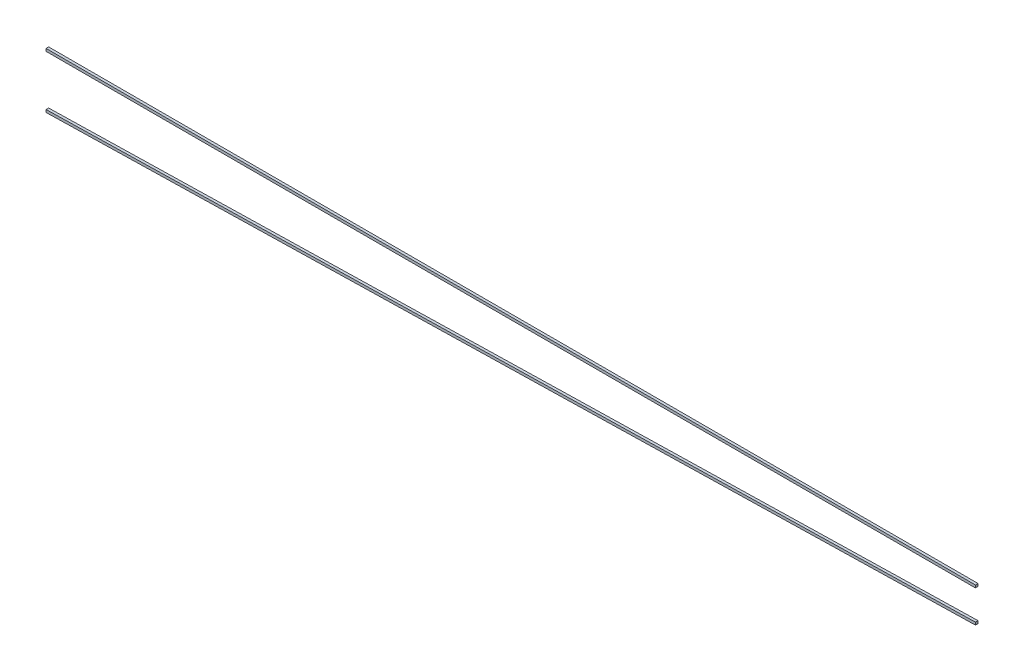
ISO-10303-21;
HEADER;
FILE_DESCRIPTION(('STEP AP214'),'2;1');
FILE_NAME('part.step','',(''),(''),'','','');
FILE_SCHEMA(('AUTOMOTIVE_DESIGN { 1 0 10303 214 1 1 1 1 }'));
ENDSEC;
DATA;
#1=APPLICATION_CONTEXT('core data for automotive mechanical design processes');
#2=APPLICATION_PROTOCOL_DEFINITION('international standard','automotive_design',2000,#1);
#3=PRODUCT_CONTEXT('',#1,'mechanical');
#4=PRODUCT('Part','Part','',(#3));
#5=PRODUCT_RELATED_PRODUCT_CATEGORY('part','',(#4));
#6=PRODUCT_DEFINITION_FORMATION('','',#4);
#7=PRODUCT_DEFINITION_CONTEXT('part definition',#1,'design');
#8=PRODUCT_DEFINITION('design','',#6,#7);
#9=PRODUCT_DEFINITION_SHAPE('','',#8);
#10=(LENGTH_UNIT() NAMED_UNIT(*) SI_UNIT(.MILLI.,.METRE.));
#11=(NAMED_UNIT(*) PLANE_ANGLE_UNIT() SI_UNIT($,.RADIAN.));
#12=(NAMED_UNIT(*) SI_UNIT($,.STERADIAN.) SOLID_ANGLE_UNIT());
#13=UNCERTAINTY_MEASURE_WITH_UNIT(LENGTH_MEASURE(1.E-05),#10,'distance_accuracy_value','');
#14=(GEOMETRIC_REPRESENTATION_CONTEXT(3) GLOBAL_UNCERTAINTY_ASSIGNED_CONTEXT((#13)) GLOBAL_UNIT_ASSIGNED_CONTEXT((#10,
#11,#12)) REPRESENTATION_CONTEXT('',''));
#15=CARTESIAN_POINT('',(0.,0.,0.));
#16=DIRECTION('',(0.,0.,1.));
#17=DIRECTION('',(1.,0.,0.));
#18=AXIS2_PLACEMENT_3D('',#15,#16,#17);
#19=CARTESIAN_POINT('',(607.600982723531,315.120329450394,2.));
#20=DIRECTION('',(0.999750935875127,0.0223173971781733,0.));
#21=DIRECTION('',(-0.0223173971781733,0.999750935875127,0.));
#22=AXIS2_PLACEMENT_3D('',#19,#20,#21);
#23=PLANE('',#22);
#24=DIRECTION('',(0.0223173971781733,-0.999750935875127,0.));
#25=VECTOR('',#24,1.);
#26=CARTESIAN_POINT('',(607.600982723531,315.120329450394,0.));
#27=LINE('',#26,#25);
#28=CARTESIAN_POINT('',(607.600982723531,315.120329450394,0.));
#29=VERTEX_POINT('',#28);
#30=CARTESIAN_POINT('',(607.645617517887,313.120827578644,0.));
#31=VERTEX_POINT('',#30);
#32=EDGE_CURVE('E114',#29,#31,#27,.T.);
#33=ORIENTED_EDGE('',*,*,#32,.T.);
#34=DIRECTION('',(0.,0.,-1.));
#35=VECTOR('',#34,1.);
#36=CARTESIAN_POINT('',(607.645617517887,313.120827578644,2.));
#37=LINE('',#36,#35);
#38=CARTESIAN_POINT('',(607.645617517887,313.120827578644,2.));
#39=VERTEX_POINT('',#38);
#40=EDGE_CURVE('E12',#39,#31,#37,.T.);
#41=ORIENTED_EDGE('',*,*,#40,.F.);
#42=DIRECTION('',(0.0223173971781733,-0.999750935875127,0.));
#43=VECTOR('',#42,1.);
#44=CARTESIAN_POINT('',(607.600982723531,315.120329450394,2.));
#45=LINE('',#44,#43);
#46=CARTESIAN_POINT('',(607.600982723531,315.120329450394,2.));
#47=VERTEX_POINT('',#46);
#48=EDGE_CURVE('E122',#47,#39,#45,.T.);
#49=ORIENTED_EDGE('',*,*,#48,.F.);
#50=DIRECTION('',(0.,0.,-1.));
#51=VECTOR('',#50,1.);
#52=CARTESIAN_POINT('',(607.600982723531,315.120329450394,2.));
#53=LINE('',#52,#51);
#54=EDGE_CURVE('E110',#47,#29,#53,.T.);
#55=ORIENTED_EDGE('',*,*,#54,.T.);
#56=EDGE_LOOP('',(#33,#41,#49,#55));
#57=FACE_BOUND('',#56,.T.);
#58=ADVANCED_FACE('F45',(#57),#23,.F.);
#59=CARTESIAN_POINT('',(1216.57449369252,326.714343704054,2.));
#60=DIRECTION('',(-0.0223180915783582,0.99975092037382,0.));
#61=DIRECTION('',(-0.99975092037382,-0.0223180915783582,0.));
#62=AXIS2_PLACEMENT_3D('',#59,#60,#61);
#63=PLANE('',#62);
#64=DIRECTION('',(0.99975092037382,0.0223180915783582,0.));
#65=VECTOR('',#64,1.);
#66=CARTESIAN_POINT('',(1216.57449369252,326.714343704054,0.));
#67=LINE('',#66,#65);
#68=CARTESIAN_POINT('',(890.239047674503,319.429344566986,0.));
#69=VERTEX_POINT('',#68);
#70=CARTESIAN_POINT('',(1324.87717903888,329.13205515646,0.));
#71=VERTEX_POINT('',#70);
#72=EDGE_CURVE('E106',#69,#71,#67,.T.);
#73=ORIENTED_EDGE('',*,*,#72,.T.);
#74=DIRECTION('',(0.,0.,-1.));
#75=VECTOR('',#74,1.);
#76=CARTESIAN_POINT('',(1324.87717903888,329.13205515646,2.));
#77=LINE('',#76,#75);
#78=CARTESIAN_POINT('',(1324.87717903888,329.13205515646,2.));
#79=VERTEX_POINT('',#78);
#80=EDGE_CURVE('E53',#79,#71,#77,.T.);
#81=ORIENTED_EDGE('',*,*,#80,.F.);
#82=DIRECTION('',(0.999750920343292,0.0223180929458715,0.));
#83=VECTOR('',#82,1.);
#84=CARTESIAN_POINT('',(890.239047674503,319.429344566986,2.));
#85=LINE('',#84,#83);
#86=CARTESIAN_POINT('',(890.239047674503,319.429344566986,2.));
#87=VERTEX_POINT('',#86);
#88=EDGE_CURVE('E98',#87,#79,#85,.T.);
#89=ORIENTED_EDGE('',*,*,#88,.F.);
#90=DIRECTION('',(0.999750920380367,0.0223180912850715,0.));
#91=VECTOR('',#90,1.);
#92=CARTESIAN_POINT('',(607.645617517887,313.120827578644,2.));
#93=LINE('',#92,#91);
#94=EDGE_CURVE('E95',#39,#87,#93,.T.);
#95=ORIENTED_EDGE('',*,*,#94,.F.);
#96=ORIENTED_EDGE('',*,*,#40,.T.);
#97=DIRECTION('',(0.999750920407981,0.0223180900480723,0.));
#98=VECTOR('',#97,1.);
#99=CARTESIAN_POINT('',(745.335428769363,316.194566834852,0.));
#100=LINE('',#99,#98);
#101=EDGE_CURVE('E117',#31,#69,#100,.T.);
#102=ORIENTED_EDGE('',*,*,#101,.T.);
#103=EDGE_LOOP('',(#73,#81,#89,#95,#96,#102));
#104=FACE_BOUND('',#103,.T.);
#105=ADVANCED_FACE('F104',(#104),#63,.F.);
#106=CARTESIAN_POINT('',(1324.87717903888,331.13205515646,2.));
#107=DIRECTION('',(-1.,0.,0.));
#108=DIRECTION('',(0.,0.,1.));
#109=AXIS2_PLACEMENT_3D('',#106,#107,#108);
#110=PLANE('',#109);
#111=DIRECTION('',(0.,1.,0.));
#112=VECTOR('',#111,1.);
#113=CARTESIAN_POINT('',(1324.87717903888,331.13205515646,0.));
#114=LINE('',#113,#112);
#115=CARTESIAN_POINT('',(1324.87717903888,331.13205515646,0.));
#116=VERTEX_POINT('',#115);
#117=EDGE_CURVE('E81',#71,#116,#114,.T.);
#118=ORIENTED_EDGE('',*,*,#117,.T.);
#119=DIRECTION('',(0.,0.,-1.));
#120=VECTOR('',#119,1.);
#121=CARTESIAN_POINT('',(1324.87717903888,331.13205515646,2.));
#122=LINE('',#121,#120);
#123=CARTESIAN_POINT('',(1324.87717903888,331.13205515646,2.));
#124=VERTEX_POINT('',#123);
#125=EDGE_CURVE('E107',#124,#116,#122,.T.);
#126=ORIENTED_EDGE('',*,*,#125,.F.);
#127=DIRECTION('',(0.,1.,0.));
#128=VECTOR('',#127,1.);
#129=CARTESIAN_POINT('',(1324.87717903888,331.13205515646,2.));
#130=LINE('',#129,#128);
#131=EDGE_CURVE('E102',#79,#124,#130,.T.);
#132=ORIENTED_EDGE('',*,*,#131,.F.);
#133=ORIENTED_EDGE('',*,*,#80,.T.);
#134=EDGE_LOOP('',(#118,#126,#132,#133));
#135=FACE_BOUND('',#134,.T.);
#136=ADVANCED_FACE('F108',(#135),#110,.F.);
#137=CARTESIAN_POINT('',(1324.87717903888,331.13205515646,2.));
#138=DIRECTION('',(0.0223173971781686,-0.999750935875127,0.));
#139=DIRECTION('',(0.999750935875127,0.0223173971781686,0.));
#140=AXIS2_PLACEMENT_3D('',#137,#138,#139);
#141=PLANE('',#140);
#142=DIRECTION('',(-0.999750935875127,-0.0223173971781686,0.));
#143=VECTOR('',#142,1.);
#144=CARTESIAN_POINT('',(1324.87717903888,331.13205515646,0.));
#145=LINE('',#144,#143);
#146=EDGE_CURVE('E87',#116,#29,#145,.T.);
#147=ORIENTED_EDGE('',*,*,#146,.T.);
#148=ORIENTED_EDGE('',*,*,#54,.F.);
#149=DIRECTION('',(-0.999750935875127,-0.0223173971781686,0.));
#150=VECTOR('',#149,1.);
#151=CARTESIAN_POINT('',(1324.87717903888,331.13205515646,2.));
#152=LINE('',#151,#150);
#153=EDGE_CURVE('E61',#124,#47,#152,.T.);
#154=ORIENTED_EDGE('',*,*,#153,.F.);
#155=ORIENTED_EDGE('',*,*,#125,.T.);
#156=EDGE_LOOP('',(#147,#148,#154,#155));
#157=FACE_BOUND('',#156,.T.);
#158=ADVANCED_FACE('F124',(#157),#141,.F.);
#159=CARTESIAN_POINT('',(0.,0.,2.));
#160=DIRECTION('',(0.,0.,-1.));
#161=DIRECTION('',(-1.,0.,0.));
#162=AXIS2_PLACEMENT_3D('',#159,#160,#161);
#163=PLANE('',#162);
#164=ORIENTED_EDGE('',*,*,#48,.T.);
#165=ORIENTED_EDGE('',*,*,#94,.T.);
#166=ORIENTED_EDGE('',*,*,#88,.T.);
#167=ORIENTED_EDGE('',*,*,#131,.T.);
#168=ORIENTED_EDGE('',*,*,#153,.T.);
#169=EDGE_LOOP('',(#164,#165,#166,#167,#168));
#170=FACE_BOUND('',#169,.T.);
#171=ADVANCED_FACE('F100',(#170),#163,.F.);
#172=CARTESIAN_POINT('',(0.,0.,0.));
#173=DIRECTION('',(0.,0.,-1.));
#174=DIRECTION('',(-1.,0.,0.));
#175=AXIS2_PLACEMENT_3D('',#172,#173,#174);
#176=PLANE('',#175);
#177=ORIENTED_EDGE('',*,*,#32,.F.);
#178=ORIENTED_EDGE('',*,*,#146,.F.);
#179=ORIENTED_EDGE('',*,*,#117,.F.);
#180=ORIENTED_EDGE('',*,*,#72,.F.);
#181=ORIENTED_EDGE('',*,*,#101,.F.);
#182=EDGE_LOOP('',(#177,#178,#179,#180,#181));
#183=FACE_BOUND('',#182,.T.);
#184=ADVANCED_FACE('F127',(#183),#176,.T.);
#185=CLOSED_SHELL('',(#58,#105,#136,#158,#171,#184));
#186=MANIFOLD_SOLID_BREP('B2',#185);
#187=CARTESIAN_POINT('',(607.645617517887,355.968593343306,2.));
#188=DIRECTION('',(1.,0.,0.));
#189=DIRECTION('',(0.,0.,-1.));
#190=AXIS2_PLACEMENT_3D('',#187,#188,#189);
#191=PLANE('',#190);
#192=DIRECTION('',(0.,-1.,0.));
#193=VECTOR('',#192,1.);
#194=CARTESIAN_POINT('',(607.645617517887,355.968593343306,0.));
#195=LINE('',#194,#193);
#196=CARTESIAN_POINT('',(607.645617517887,355.968593343306,0.));
#197=VERTEX_POINT('',#196);
#198=CARTESIAN_POINT('',(607.645617517887,353.968593343306,0.));
#199=VERTEX_POINT('',#198);
#200=EDGE_CURVE('E260',#197,#199,#195,.T.);
#201=ORIENTED_EDGE('',*,*,#200,.T.);
#202=DIRECTION('',(0.,0.,-1.));
#203=VECTOR('',#202,1.);
#204=CARTESIAN_POINT('',(607.645617517887,353.968593343306,2.));
#205=LINE('',#204,#203);
#206=CARTESIAN_POINT('',(607.645617517887,353.968593343306,2.));
#207=VERTEX_POINT('',#206);
#208=EDGE_CURVE('E43',#207,#199,#205,.T.);
#209=ORIENTED_EDGE('',*,*,#208,.F.);
#210=DIRECTION('',(0.,-1.,0.));
#211=VECTOR('',#210,1.);
#212=CARTESIAN_POINT('',(607.645617517887,355.968593343306,2.));
#213=LINE('',#212,#211);
#214=CARTESIAN_POINT('',(607.645617517887,355.968593343306,2.));
#215=VERTEX_POINT('',#214);
#216=EDGE_CURVE('E246',#215,#207,#213,.T.);
#217=ORIENTED_EDGE('',*,*,#216,.F.);
#218=DIRECTION('',(0.,0.,-1.));
#219=VECTOR('',#218,1.);
#220=CARTESIAN_POINT('',(607.645617517887,355.968593343306,2.));
#221=LINE('',#220,#219);
#222=EDGE_CURVE('E256',#215,#197,#221,.T.);
#223=ORIENTED_EDGE('',*,*,#222,.T.);
#224=EDGE_LOOP('',(#201,#209,#217,#223));
#225=FACE_BOUND('',#224,.T.);
#226=ADVANCED_FACE('F196',(#225),#191,.F.);
#227=CARTESIAN_POINT('',(607.645617517887,353.968593343306,2.));
#228=DIRECTION('',(0.,1.,0.));
#229=DIRECTION('',(0.,0.,1.));
#230=AXIS2_PLACEMENT_3D('',#227,#228,#229);
#231=PLANE('',#230);
#232=DIRECTION('',(1.,0.,0.));
#233=VECTOR('',#232,1.);
#234=CARTESIAN_POINT('',(607.645617517887,353.968593343306,0.));
#235=LINE('',#234,#233);
#236=CARTESIAN_POINT('',(1324.87717903888,353.968593343306,0.));
#237=VERTEX_POINT('',#236);
#238=EDGE_CURVE('E251',#199,#237,#235,.T.);
#239=ORIENTED_EDGE('',*,*,#238,.T.);
#240=DIRECTION('',(0.,0.,-1.));
#241=VECTOR('',#240,1.);
#242=CARTESIAN_POINT('',(1324.87717903888,353.968593343306,2.));
#243=LINE('',#242,#241);
#244=CARTESIAN_POINT('',(1324.87717903888,353.968593343306,2.));
#245=VERTEX_POINT('',#244);
#246=EDGE_CURVE('E204',#245,#237,#243,.T.);
#247=ORIENTED_EDGE('',*,*,#246,.F.);
#248=DIRECTION('',(1.,0.,0.));
#249=VECTOR('',#248,1.);
#250=CARTESIAN_POINT('',(607.645617517887,353.968593343306,2.));
#251=LINE('',#250,#249);
#252=EDGE_CURVE('E240',#207,#245,#251,.T.);
#253=ORIENTED_EDGE('',*,*,#252,.F.);
#254=ORIENTED_EDGE('',*,*,#208,.T.);
#255=EDGE_LOOP('',(#239,#247,#253,#254));
#256=FACE_BOUND('',#255,.T.);
#257=ADVANCED_FACE('F250',(#256),#231,.F.);
#258=CARTESIAN_POINT('',(1324.87717903888,355.968593343306,2.));
#259=DIRECTION('',(-1.,0.,0.));
#260=DIRECTION('',(0.,0.,1.));
#261=AXIS2_PLACEMENT_3D('',#258,#259,#260);
#262=PLANE('',#261);
#263=DIRECTION('',(0.,1.,0.));
#264=VECTOR('',#263,1.);
#265=CARTESIAN_POINT('',(1324.87717903888,355.968593343306,0.));
#266=LINE('',#265,#264);
#267=CARTESIAN_POINT('',(1324.87717903888,355.968593343306,0.));
#268=VERTEX_POINT('',#267);
#269=EDGE_CURVE('E264',#237,#268,#266,.T.);
#270=ORIENTED_EDGE('',*,*,#269,.T.);
#271=DIRECTION('',(0.,0.,-1.));
#272=VECTOR('',#271,1.);
#273=CARTESIAN_POINT('',(1324.87717903888,355.968593343306,2.));
#274=LINE('',#273,#272);
#275=CARTESIAN_POINT('',(1324.87717903888,355.968593343306,2.));
#276=VERTEX_POINT('',#275);
#277=EDGE_CURVE('E253',#276,#268,#274,.T.);
#278=ORIENTED_EDGE('',*,*,#277,.F.);
#279=DIRECTION('',(0.,1.,0.));
#280=VECTOR('',#279,1.);
#281=CARTESIAN_POINT('',(1324.87717903888,355.968593343306,2.));
#282=LINE('',#281,#280);
#283=EDGE_CURVE('E243',#245,#276,#282,.T.);
#284=ORIENTED_EDGE('',*,*,#283,.F.);
#285=ORIENTED_EDGE('',*,*,#246,.T.);
#286=EDGE_LOOP('',(#270,#278,#284,#285));
#287=FACE_BOUND('',#286,.T.);
#288=ADVANCED_FACE('F254',(#287),#262,.F.);
#289=CARTESIAN_POINT('',(607.645617517887,355.968593343306,2.));
#290=DIRECTION('',(0.,-1.,0.));
#291=DIRECTION('',(0.,0.,-1.));
#292=AXIS2_PLACEMENT_3D('',#289,#290,#291);
#293=PLANE('',#292);
#294=DIRECTION('',(-1.,0.,0.));
#295=VECTOR('',#294,1.);
#296=CARTESIAN_POINT('',(607.645617517887,355.968593343306,0.));
#297=LINE('',#296,#295);
#298=EDGE_CURVE('E229',#268,#197,#297,.T.);
#299=ORIENTED_EDGE('',*,*,#298,.T.);
#300=ORIENTED_EDGE('',*,*,#222,.F.);
#301=DIRECTION('',(-1.,0.,0.));
#302=VECTOR('',#301,1.);
#303=CARTESIAN_POINT('',(1216.57449369252,355.968593343306,2.));
#304=LINE('',#303,#302);
#305=EDGE_CURVE('E212',#276,#215,#304,.T.);
#306=ORIENTED_EDGE('',*,*,#305,.F.);
#307=ORIENTED_EDGE('',*,*,#277,.T.);
#308=EDGE_LOOP('',(#299,#300,#306,#307));
#309=FACE_BOUND('',#308,.T.);
#310=ADVANCED_FACE('F268',(#309),#293,.F.);
#311=CARTESIAN_POINT('',(0.,0.,2.));
#312=DIRECTION('',(0.,0.,1.));
#313=DIRECTION('',(1.,0.,0.));
#314=AXIS2_PLACEMENT_3D('',#311,#312,#313);
#315=PLANE('',#314);
#316=ORIENTED_EDGE('',*,*,#216,.T.);
#317=ORIENTED_EDGE('',*,*,#252,.T.);
#318=ORIENTED_EDGE('',*,*,#283,.T.);
#319=ORIENTED_EDGE('',*,*,#305,.T.);
#320=EDGE_LOOP('',(#316,#317,#318,#319));
#321=FACE_BOUND('',#320,.T.);
#322=ADVANCED_FACE('F241',(#321),#315,.T.);
#323=CARTESIAN_POINT('',(0.,0.,0.));
#324=DIRECTION('',(0.,0.,1.));
#325=DIRECTION('',(1.,0.,0.));
#326=AXIS2_PLACEMENT_3D('',#323,#324,#325);
#327=PLANE('',#326);
#328=ORIENTED_EDGE('',*,*,#200,.F.);
#329=ORIENTED_EDGE('',*,*,#298,.F.);
#330=ORIENTED_EDGE('',*,*,#269,.F.);
#331=ORIENTED_EDGE('',*,*,#238,.F.);
#332=EDGE_LOOP('',(#328,#329,#330,#331));
#333=FACE_BOUND('',#332,.T.);
#334=ADVANCED_FACE('F270',(#333),#327,.F.);
#335=CLOSED_SHELL('',(#226,#257,#288,#310,#322,#334));
#336=MANIFOLD_SOLID_BREP('B6',#335);
#337=ADVANCED_BREP_SHAPE_REPRESENTATION('',(#18,#186,#336),#14);
#338=SHAPE_DEFINITION_REPRESENTATION(#9,#337);
ENDSEC;
END-ISO-10303-21;
